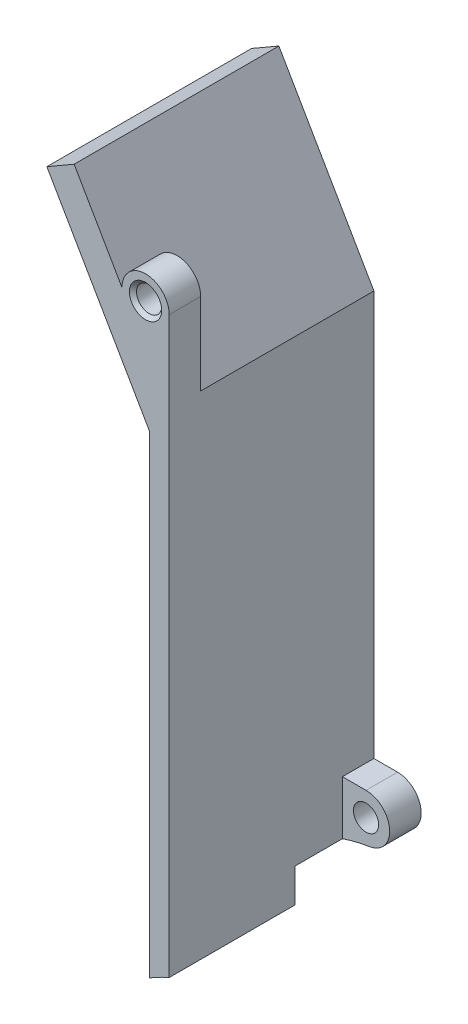
ISO-10303-21;
HEADER;
FILE_DESCRIPTION(('STEP AP214'),'2;1');
FILE_NAME('part.step','',(''),(''),'','','');
FILE_SCHEMA(('AUTOMOTIVE_DESIGN { 1 0 10303 214 1 1 1 1 }'));
ENDSEC;
DATA;
#1=APPLICATION_CONTEXT('core data for automotive mechanical design processes');
#2=APPLICATION_PROTOCOL_DEFINITION('international standard','automotive_design',2000,#1);
#3=PRODUCT_CONTEXT('',#1,'mechanical');
#4=PRODUCT('Part','Part','',(#3));
#5=PRODUCT_RELATED_PRODUCT_CATEGORY('part','',(#4));
#6=PRODUCT_DEFINITION_FORMATION('','',#4);
#7=PRODUCT_DEFINITION_CONTEXT('part definition',#1,'design');
#8=PRODUCT_DEFINITION('design','',#6,#7);
#9=PRODUCT_DEFINITION_SHAPE('','',#8);
#10=(LENGTH_UNIT() NAMED_UNIT(*) SI_UNIT(.MILLI.,.METRE.));
#11=(NAMED_UNIT(*) PLANE_ANGLE_UNIT() SI_UNIT($,.RADIAN.));
#12=(NAMED_UNIT(*) SI_UNIT($,.STERADIAN.) SOLID_ANGLE_UNIT());
#13=UNCERTAINTY_MEASURE_WITH_UNIT(LENGTH_MEASURE(1.E-05),#10,'distance_accuracy_value','');
#14=(GEOMETRIC_REPRESENTATION_CONTEXT(3) GLOBAL_UNCERTAINTY_ASSIGNED_CONTEXT((#13)) GLOBAL_UNIT_ASSIGNED_CONTEXT((#10,
#11,#12)) REPRESENTATION_CONTEXT('',''));
#15=CARTESIAN_POINT('',(0.,0.,0.));
#16=DIRECTION('',(0.,0.,1.));
#17=DIRECTION('',(1.,0.,0.));
#18=AXIS2_PLACEMENT_3D('',#15,#16,#17);
#19=CARTESIAN_POINT('',(2.57088886237952,0.,-15.));
#20=DIRECTION('',(-1.,0.,0.));
#21=DIRECTION('',(0.,0.,1.));
#22=AXIS2_PLACEMENT_3D('',#19,#20,#21);
#23=PLANE('',#22);
#24=DIRECTION('',(0.,-1.,0.));
#25=VECTOR('',#24,1.);
#26=CARTESIAN_POINT('',(2.57088886237952,0.,-13.));
#27=LINE('',#26,#25);
#28=CARTESIAN_POINT('',(2.57088886237952,-38.1610373207469,-13.));
#29=VERTEX_POINT('',#28);
#30=CARTESIAN_POINT('',(2.57088886237952,-41.5716731926929,-13.));
#31=VERTEX_POINT('',#30);
#32=EDGE_CURVE('E182',#29,#31,#27,.T.);
#33=ORIENTED_EDGE('',*,*,#32,.F.);
#34=DIRECTION('',(0.,0.,-1.));
#35=VECTOR('',#34,1.);
#36=CARTESIAN_POINT('',(2.57088886237952,-38.1610373207469,-13.));
#37=LINE('',#36,#35);
#38=CARTESIAN_POINT('',(2.57088886237952,-38.1610373207469,-15.));
#39=VERTEX_POINT('',#38);
#40=EDGE_CURVE('E193',#29,#39,#37,.T.);
#41=ORIENTED_EDGE('',*,*,#40,.T.);
#42=DIRECTION('',(0.,-1.,0.));
#43=VECTOR('',#42,1.);
#44=CARTESIAN_POINT('',(2.57088886237952,0.,-15.));
#45=LINE('',#44,#43);
#46=CARTESIAN_POINT('',(2.57088886237952,-12.4529101302543,-15.));
#47=VERTEX_POINT('',#46);
#48=EDGE_CURVE('E211',#47,#39,#45,.T.);
#49=ORIENTED_EDGE('',*,*,#48,.F.);
#50=DIRECTION('',(0.,0.,1.));
#51=VECTOR('',#50,1.);
#52=CARTESIAN_POINT('',(2.57088886237952,-12.4529101302543,-15.));
#53=LINE('',#52,#51);
#54=CARTESIAN_POINT('',(2.57088886237953,-12.4529101302543,-4.));
#55=VERTEX_POINT('',#54);
#56=EDGE_CURVE('E167',#47,#55,#53,.T.);
#57=ORIENTED_EDGE('',*,*,#56,.T.);
#58=DIRECTION('',(0.,1.,0.));
#59=VECTOR('',#58,1.);
#60=CARTESIAN_POINT('',(2.57088886237952,0.,-4.));
#61=LINE('',#60,#59);
#62=CARTESIAN_POINT('',(2.57088886237952,-7.25675770754768,-4.));
#63=VERTEX_POINT('',#62);
#64=EDGE_CURVE('E162',#55,#63,#61,.T.);
#65=ORIENTED_EDGE('',*,*,#64,.T.);
#66=DIRECTION('',(0.,0.,1.));
#67=VECTOR('',#66,1.);
#68=CARTESIAN_POINT('',(2.57088886237952,-7.25675770754768,-4.));
#69=LINE('',#68,#67);
#70=CARTESIAN_POINT('',(2.57088886237952,-7.25675770754768,-2.));
#71=VERTEX_POINT('',#70);
#72=EDGE_CURVE('E147',#63,#71,#69,.T.);
#73=ORIENTED_EDGE('',*,*,#72,.T.);
#74=DIRECTION('',(0.,-1.,0.));
#75=VECTOR('',#74,1.);
#76=CARTESIAN_POINT('',(2.57088886237952,0.,-2.));
#77=LINE('',#76,#75);
#78=CARTESIAN_POINT('',(2.57088886237952,-43.7084380241115,-2.));
#79=VERTEX_POINT('',#78);
#80=EDGE_CURVE('E230',#71,#79,#77,.T.);
#81=ORIENTED_EDGE('',*,*,#80,.T.);
#82=DIRECTION('',(0.,0.,1.));
#83=VECTOR('',#82,1.);
#84=CARTESIAN_POINT('',(2.57088886237952,-43.7084380241115,-15.));
#85=LINE('',#84,#83);
#86=CARTESIAN_POINT('',(2.57088886237952,-43.7084380241115,-10.));
#87=VERTEX_POINT('',#86);
#88=EDGE_CURVE('E227',#87,#79,#85,.T.);
#89=ORIENTED_EDGE('',*,*,#88,.F.);
#90=DIRECTION('',(0.,-1.,0.));
#91=VECTOR('',#90,1.);
#92=CARTESIAN_POINT('',(2.57088886237952,0.,-10.));
#93=LINE('',#92,#91);
#94=CARTESIAN_POINT('',(2.57088886237952,-41.5716731926929,-10.));
#95=VERTEX_POINT('',#94);
#96=EDGE_CURVE('E57',#95,#87,#93,.T.);
#97=ORIENTED_EDGE('',*,*,#96,.F.);
#98=DIRECTION('',(0.,0.,-1.));
#99=VECTOR('',#98,1.);
#100=CARTESIAN_POINT('',(2.57088886237952,-41.5716731926929,-10.));
#101=LINE('',#100,#99);
#102=EDGE_CURVE('E200',#95,#31,#101,.T.);
#103=ORIENTED_EDGE('',*,*,#102,.T.);
#104=EDGE_LOOP('',(#33,#41,#49,#57,#65,#73,#81,#89,#97,#103));
#105=FACE_BOUND('',#104,.T.);
#106=ADVANCED_FACE('F48',(#105),#23,.F.);
#107=CARTESIAN_POINT('',(6.07088886237952,-52.,-15.));
#108=DIRECTION('',(0.,0.,1.));
#109=DIRECTION('',(1.,0.,0.));
#110=AXIS2_PLACEMENT_3D('',#107,#108,#109);
#111=CYLINDRICAL_SURFACE('',#110,9.);
#112=CARTESIAN_POINT('',(6.07088886237952,-52.,-10.));
#113=DIRECTION('',(0.,0.,-1.));
#114=DIRECTION('',(-1.,0.,0.));
#115=AXIS2_PLACEMENT_3D('',#112,#113,#114);
#116=CIRCLE('',#115,9.);
#117=CARTESIAN_POINT('',(1.32088886237954,-44.3555575742897,-10.));
#118=VERTEX_POINT('',#117);
#119=EDGE_CURVE('E205',#87,#118,#116,.F.);
#120=ORIENTED_EDGE('',*,*,#119,.F.);
#121=ORIENTED_EDGE('',*,*,#88,.T.);
#122=CARTESIAN_POINT('',(6.07088886237952,-52.,-2.));
#123=DIRECTION('',(0.,0.,1.));
#124=DIRECTION('',(1.,0.,0.));
#125=AXIS2_PLACEMENT_3D('',#122,#123,#124);
#126=CIRCLE('',#125,9.);
#127=CARTESIAN_POINT('',(1.32088886237953,-44.3555575742896,-2.));
#128=VERTEX_POINT('',#127);
#129=EDGE_CURVE('E210',#79,#128,#126,.T.);
#130=ORIENTED_EDGE('',*,*,#129,.T.);
#131=DIRECTION('',(0.,0.,1.));
#132=VECTOR('',#131,1.);
#133=CARTESIAN_POINT('',(1.32088886237953,-44.3555575742896,-15.));
#134=LINE('',#133,#132);
#135=EDGE_CURVE('E242',#118,#128,#134,.T.);
#136=ORIENTED_EDGE('',*,*,#135,.F.);
#137=EDGE_LOOP('',(#120,#121,#130,#136));
#138=FACE_BOUND('',#137,.T.);
#139=ADVANCED_FACE('F50',(#138),#111,.F.);
#140=CARTESIAN_POINT('',(1.32088886237952,0.,-15.));
#141=DIRECTION('',(-1.,0.,0.));
#142=DIRECTION('',(0.,-1.,0.));
#143=AXIS2_PLACEMENT_3D('',#140,#141,#142);
#144=PLANE('',#143);
#145=DIRECTION('',(0.,0.,-1.));
#146=VECTOR('',#145,1.);
#147=CARTESIAN_POINT('',(1.32088886237953,-42.0784325835078,-10.));
#148=LINE('',#147,#146);
#149=CARTESIAN_POINT('',(1.32088886237953,-42.0784325835078,-10.));
#150=VERTEX_POINT('',#149);
#151=CARTESIAN_POINT('',(1.32088886237953,-42.0784325835078,-15.));
#152=VERTEX_POINT('',#151);
#153=EDGE_CURVE('E73',#150,#152,#148,.T.);
#154=ORIENTED_EDGE('',*,*,#153,.F.);
#155=DIRECTION('',(0.,-1.,0.));
#156=VECTOR('',#155,1.);
#157=CARTESIAN_POINT('',(1.32088886237952,0.,-10.));
#158=LINE('',#157,#156);
#159=EDGE_CURVE('E207',#150,#118,#158,.T.);
#160=ORIENTED_EDGE('',*,*,#159,.T.);
#161=ORIENTED_EDGE('',*,*,#135,.T.);
#162=DIRECTION('',(0.,-1.,0.));
#163=VECTOR('',#162,1.);
#164=CARTESIAN_POINT('',(1.32088886237952,0.,-2.));
#165=LINE('',#164,#163);
#166=CARTESIAN_POINT('',(1.32088886237953,-14.2878466207932,-2.));
#167=VERTEX_POINT('',#166);
#168=EDGE_CURVE('E215',#167,#128,#165,.T.);
#169=ORIENTED_EDGE('',*,*,#168,.F.);
#170=DIRECTION('',(0.,0.,1.));
#171=VECTOR('',#170,1.);
#172=CARTESIAN_POINT('',(1.32088886237953,-14.2878466207932,-15.));
#173=LINE('',#172,#171);
#174=CARTESIAN_POINT('',(1.32088886237953,-14.2878466207932,-15.));
#175=VERTEX_POINT('',#174);
#176=EDGE_CURVE('E244',#175,#167,#173,.T.);
#177=ORIENTED_EDGE('',*,*,#176,.F.);
#178=DIRECTION('',(0.,-1.,0.));
#179=VECTOR('',#178,1.);
#180=CARTESIAN_POINT('',(1.32088886237952,0.,-15.));
#181=LINE('',#180,#179);
#182=EDGE_CURVE('E224',#175,#152,#181,.T.);
#183=ORIENTED_EDGE('',*,*,#182,.T.);
#184=EDGE_LOOP('',(#154,#160,#161,#169,#177,#183));
#185=FACE_BOUND('',#184,.T.);
#186=ADVANCED_FACE('F295',(#185),#144,.T.);
#187=CARTESIAN_POINT('',(-5.19615242270664,-2.99999999999999,-15.));
#188=DIRECTION('',(-0.86602540378444,-0.499999999999998,0.));
#189=DIRECTION('',(0.499999999999998,-0.86602540378444,0.));
#190=AXIS2_PLACEMENT_3D('',#187,#188,#189);
#191=PLANE('',#190);
#192=DIRECTION('',(0.499999999999998,-0.86602540378444,0.));
#193=VECTOR('',#192,1.);
#194=CARTESIAN_POINT('',(-5.19615242270664,-2.99999999999999,-2.));
#195=LINE('',#194,#193);
#196=CARTESIAN_POINT('',(-5.19615242270665,-2.99999999999997,-2.));
#197=VERTEX_POINT('',#196);
#198=EDGE_CURVE('E237',#197,#167,#195,.T.);
#199=ORIENTED_EDGE('',*,*,#198,.F.);
#200=DIRECTION('',(0.,0.,1.));
#201=VECTOR('',#200,1.);
#202=CARTESIAN_POINT('',(-5.19615242270665,-2.99999999999997,-15.));
#203=LINE('',#202,#201);
#204=CARTESIAN_POINT('',(-5.19615242270665,-2.99999999999997,-15.));
#205=VERTEX_POINT('',#204);
#206=EDGE_CURVE('E246',#205,#197,#203,.T.);
#207=ORIENTED_EDGE('',*,*,#206,.F.);
#208=DIRECTION('',(0.499999999999998,-0.86602540378444,0.));
#209=VECTOR('',#208,1.);
#210=CARTESIAN_POINT('',(-5.19615242270664,-2.99999999999999,-15.));
#211=LINE('',#210,#209);
#212=EDGE_CURVE('E221',#205,#175,#211,.T.);
#213=ORIENTED_EDGE('',*,*,#212,.T.);
#214=ORIENTED_EDGE('',*,*,#176,.T.);
#215=EDGE_LOOP('',(#199,#207,#213,#214));
#216=FACE_BOUND('',#215,.T.);
#217=ADVANCED_FACE('F299',(#216),#191,.T.);
#218=CARTESIAN_POINT('',(0.,0.,-15.));
#219=DIRECTION('',(-0.499999999999999,0.866025403784439,0.));
#220=DIRECTION('',(-0.86602540378444,-0.499999999999999,0.));
#221=AXIS2_PLACEMENT_3D('',#218,#219,#220);
#222=PLANE('',#221);
#223=DIRECTION('',(-0.86602540378444,-0.499999999999999,0.));
#224=VECTOR('',#223,1.);
#225=CARTESIAN_POINT('',(0.,0.,-2.));
#226=LINE('',#225,#224);
#227=CARTESIAN_POINT('',(-3.46410161513777,-1.99999999999997,-2.));
#228=VERTEX_POINT('',#227);
#229=EDGE_CURVE('E234',#228,#197,#226,.T.);
#230=ORIENTED_EDGE('',*,*,#229,.F.);
#231=DIRECTION('',(0.,0.,1.));
#232=VECTOR('',#231,1.);
#233=CARTESIAN_POINT('',(-3.46410161513777,-1.99999999999997,-15.));
#234=LINE('',#233,#232);
#235=CARTESIAN_POINT('',(-3.46410161513777,-1.99999999999997,-15.));
#236=VERTEX_POINT('',#235);
#237=EDGE_CURVE('E248',#236,#228,#234,.T.);
#238=ORIENTED_EDGE('',*,*,#237,.F.);
#239=DIRECTION('',(-0.86602540378444,-0.499999999999999,0.));
#240=VECTOR('',#239,1.);
#241=CARTESIAN_POINT('',(0.,0.,-15.));
#242=LINE('',#241,#240);
#243=EDGE_CURVE('E218',#236,#205,#242,.T.);
#244=ORIENTED_EDGE('',*,*,#243,.T.);
#245=ORIENTED_EDGE('',*,*,#206,.T.);
#246=EDGE_LOOP('',(#230,#238,#244,#245));
#247=FACE_BOUND('',#246,.T.);
#248=ADVANCED_FACE('F302',(#247),#222,.T.);
#249=CARTESIAN_POINT('',(-3.46410161513776,-1.99999999999999,-15.));
#250=DIRECTION('',(0.86602540378444,0.499999999999998,0.));
#251=DIRECTION('',(-0.499999999999998,0.86602540378444,0.));
#252=AXIS2_PLACEMENT_3D('',#249,#250,#251);
#253=PLANE('',#252);
#254=DIRECTION('',(0.,0.,1.));
#255=VECTOR('',#254,1.);
#256=CARTESIAN_POINT('',(-0.429111137620476,-7.25675770754767,-4.));
#257=LINE('',#256,#255);
#258=CARTESIAN_POINT('',(-0.429111137620476,-7.25675770754767,-4.));
#259=VERTEX_POINT('',#258);
#260=CARTESIAN_POINT('',(-0.429111137620476,-7.25675770754767,-2.));
#261=VERTEX_POINT('',#260);
#262=EDGE_CURVE('E157',#259,#261,#257,.T.);
#263=ORIENTED_EDGE('',*,*,#262,.F.);
#264=DIRECTION('',(0.499999999999998,-0.86602540378444,0.));
#265=VECTOR('',#264,1.);
#266=CARTESIAN_POINT('',(-3.46410161513776,-1.99999999999999,-4.));
#267=LINE('',#266,#265);
#268=EDGE_CURVE('E12',#259,#55,#267,.T.);
#269=ORIENTED_EDGE('',*,*,#268,.T.);
#270=ORIENTED_EDGE('',*,*,#56,.F.);
#271=DIRECTION('',(-0.499999999999998,0.86602540378444,0.));
#272=VECTOR('',#271,1.);
#273=CARTESIAN_POINT('',(-3.46410161513776,-1.99999999999999,-15.));
#274=LINE('',#273,#272);
#275=EDGE_CURVE('E214',#47,#236,#274,.T.);
#276=ORIENTED_EDGE('',*,*,#275,.T.);
#277=ORIENTED_EDGE('',*,*,#237,.T.);
#278=DIRECTION('',(-0.499999999999998,0.86602540378444,0.));
#279=VECTOR('',#278,1.);
#280=CARTESIAN_POINT('',(-3.46410161513776,-1.99999999999999,-2.));
#281=LINE('',#280,#279);
#282=EDGE_CURVE('E232',#261,#228,#281,.T.);
#283=ORIENTED_EDGE('',*,*,#282,.F.);
#284=EDGE_LOOP('',(#263,#269,#270,#276,#277,#283));
#285=FACE_BOUND('',#284,.T.);
#286=ADVANCED_FACE('F278',(#285),#253,.T.);
#287=CARTESIAN_POINT('',(0.,0.,-15.));
#288=DIRECTION('',(0.,0.,1.));
#289=DIRECTION('',(1.,0.,0.));
#290=AXIS2_PLACEMENT_3D('',#287,#288,#289);
#291=PLANE('',#290);
#292=CARTESIAN_POINT('',(4.07088886237953,-39.6610373207469,-15.));
#293=DIRECTION('',(0.,0.,-1.));
#294=DIRECTION('',(-1.,0.,0.));
#295=AXIS2_PLACEMENT_3D('',#292,#293,#294);
#296=CIRCLE('',#295,1.025);
#297=CARTESIAN_POINT('',(3.04588886237953,-39.6610373207469,-15.));
#298=VERTEX_POINT('',#297);
#299=EDGE_CURVE('E268',#298,#298,#296,.T.);
#300=ORIENTED_EDGE('',*,*,#299,.F.);
#301=EDGE_LOOP('',(#300));
#302=FACE_BOUND('',#301,.T.);
#303=ORIENTED_EDGE('',*,*,#48,.T.);
#304=DIRECTION('',(-1.,0.,0.));
#305=VECTOR('',#304,1.);
#306=CARTESIAN_POINT('',(0.,-38.1610373207469,-15.));
#307=LINE('',#306,#305);
#308=CARTESIAN_POINT('',(4.07088886237953,-38.1610373207469,-15.));
#309=VERTEX_POINT('',#308);
#310=EDGE_CURVE('E65',#309,#39,#307,.T.);
#311=ORIENTED_EDGE('',*,*,#310,.F.);
#312=CARTESIAN_POINT('',(4.07088886237953,-39.6610373207469,-15.));
#313=DIRECTION('',(0.,0.,-1.));
#314=DIRECTION('',(-1.,0.,0.));
#315=AXIS2_PLACEMENT_3D('',#312,#313,#314);
#316=CIRCLE('',#315,1.5);
#317=CARTESIAN_POINT('',(4.31088886237952,-41.1417128422573,-15.));
#318=VERTEX_POINT('',#317);
#319=EDGE_CURVE('E176',#309,#318,#316,.T.);
#320=ORIENTED_EDGE('',*,*,#319,.T.);
#321=CARTESIAN_POINT('',(6.07088886237952,-52.,-15.));
#322=DIRECTION('',(0.,0.,-1.));
#323=DIRECTION('',(-1.,0.,0.));
#324=AXIS2_PLACEMENT_3D('',#321,#322,#323);
#325=CIRCLE('',#324,11.);
#326=EDGE_CURVE('E192',#152,#318,#325,.T.);
#327=ORIENTED_EDGE('',*,*,#326,.F.);
#328=ORIENTED_EDGE('',*,*,#182,.F.);
#329=ORIENTED_EDGE('',*,*,#212,.F.);
#330=ORIENTED_EDGE('',*,*,#243,.F.);
#331=ORIENTED_EDGE('',*,*,#275,.F.);
#332=EDGE_LOOP('',(#303,#311,#320,#327,#328,#329,#330,#331));
#333=FACE_BOUND('',#332,.T.);
#334=ADVANCED_FACE('F274',(#302,#333),#291,.F.);
#335=CARTESIAN_POINT('',(0.,0.,-2.));
#336=DIRECTION('',(0.,0.,1.));
#337=DIRECTION('',(1.,0.,0.));
#338=AXIS2_PLACEMENT_3D('',#335,#336,#337);
#339=PLANE('',#338);
#340=CARTESIAN_POINT('',(1.07088886237952,-7.25675770754768,-2.));
#341=DIRECTION('',(0.,0.,1.));
#342=DIRECTION('',(1.,0.,0.));
#343=AXIS2_PLACEMENT_3D('',#340,#341,#342);
#344=CIRCLE('',#343,1.025);
#345=CARTESIAN_POINT('',(2.09588886237952,-7.25675770754768,-2.));
#346=VERTEX_POINT('',#345);
#347=EDGE_CURVE('E257',#346,#346,#344,.T.);
#348=ORIENTED_EDGE('',*,*,#347,.F.);
#349=EDGE_LOOP('',(#348));
#350=FACE_BOUND('',#349,.T.);
#351=CARTESIAN_POINT('',(1.07088886237952,-7.25675770754768,-2.));
#352=DIRECTION('',(0.,0.,1.));
#353=DIRECTION('',(1.,0.,0.));
#354=AXIS2_PLACEMENT_3D('',#351,#352,#353);
#355=CIRCLE('',#354,1.5);
#356=EDGE_CURVE('E153',#71,#261,#355,.T.);
#357=ORIENTED_EDGE('',*,*,#356,.T.);
#358=ORIENTED_EDGE('',*,*,#282,.T.);
#359=ORIENTED_EDGE('',*,*,#229,.T.);
#360=ORIENTED_EDGE('',*,*,#198,.T.);
#361=ORIENTED_EDGE('',*,*,#168,.T.);
#362=ORIENTED_EDGE('',*,*,#129,.F.);
#363=ORIENTED_EDGE('',*,*,#80,.F.);
#364=EDGE_LOOP('',(#357,#358,#359,#360,#361,#362,#363));
#365=FACE_BOUND('',#364,.T.);
#366=ADVANCED_FACE('F277',(#350,#365),#339,.T.);
#367=CARTESIAN_POINT('',(6.07088886237952,-52.,-10.));
#368=DIRECTION('',(0.,0.,-1.));
#369=DIRECTION('',(-1.,0.,0.));
#370=AXIS2_PLACEMENT_3D('',#367,#368,#369);
#371=CYLINDRICAL_SURFACE('',#370,11.);
#372=ORIENTED_EDGE('',*,*,#153,.T.);
#373=ORIENTED_EDGE('',*,*,#326,.T.);
#374=DIRECTION('',(0.,0.,-1.));
#375=VECTOR('',#374,1.);
#376=CARTESIAN_POINT('',(4.31088886237952,-41.1417128422573,-13.));
#377=LINE('',#376,#375);
#378=CARTESIAN_POINT('',(4.31088886237952,-41.1417128422573,-13.));
#379=VERTEX_POINT('',#378);
#380=EDGE_CURVE('E186',#379,#318,#377,.T.);
#381=ORIENTED_EDGE('',*,*,#380,.F.);
#382=CARTESIAN_POINT('',(6.07088886237952,-52.,-13.));
#383=DIRECTION('',(0.,0.,-1.));
#384=DIRECTION('',(-1.,0.,0.));
#385=AXIS2_PLACEMENT_3D('',#382,#383,#384);
#386=CIRCLE('',#385,11.);
#387=EDGE_CURVE('E180',#31,#379,#386,.T.);
#388=ORIENTED_EDGE('',*,*,#387,.F.);
#389=ORIENTED_EDGE('',*,*,#102,.F.);
#390=CARTESIAN_POINT('',(6.07088886237952,-52.,-10.));
#391=DIRECTION('',(0.,0.,-1.));
#392=DIRECTION('',(-1.,0.,0.));
#393=AXIS2_PLACEMENT_3D('',#390,#391,#392);
#394=CIRCLE('',#393,11.);
#395=EDGE_CURVE('E197',#150,#95,#394,.T.);
#396=ORIENTED_EDGE('',*,*,#395,.F.);
#397=EDGE_LOOP('',(#372,#373,#381,#388,#389,#396));
#398=FACE_BOUND('',#397,.T.);
#399=ADVANCED_FACE('F314',(#398),#371,.F.);
#400=CARTESIAN_POINT('',(6.07088886237952,-52.,-10.));
#401=DIRECTION('',(0.,0.,-1.));
#402=DIRECTION('',(-1.,0.,0.));
#403=AXIS2_PLACEMENT_3D('',#400,#401,#402);
#404=PLANE('',#403);
#405=ORIENTED_EDGE('',*,*,#395,.T.);
#406=ORIENTED_EDGE('',*,*,#96,.T.);
#407=ORIENTED_EDGE('',*,*,#119,.T.);
#408=ORIENTED_EDGE('',*,*,#159,.F.);
#409=EDGE_LOOP('',(#405,#406,#407,#408));
#410=FACE_BOUND('',#409,.T.);
#411=ADVANCED_FACE('F313',(#410),#404,.T.);
#412=CARTESIAN_POINT('',(4.07088886237953,-39.6610373207469,-13.));
#413=DIRECTION('',(0.,0.,-1.));
#414=DIRECTION('',(-1.,0.,0.));
#415=AXIS2_PLACEMENT_3D('',#412,#413,#414);
#416=CYLINDRICAL_SURFACE('',#415,1.5);
#417=ORIENTED_EDGE('',*,*,#319,.F.);
#418=DIRECTION('',(0.,0.,-1.));
#419=VECTOR('',#418,1.);
#420=CARTESIAN_POINT('',(4.07088886237953,-38.1610373207469,-13.));
#421=LINE('',#420,#419);
#422=CARTESIAN_POINT('',(4.07088886237953,-38.1610373207469,-13.));
#423=VERTEX_POINT('',#422);
#424=EDGE_CURVE('E190',#423,#309,#421,.T.);
#425=ORIENTED_EDGE('',*,*,#424,.F.);
#426=CARTESIAN_POINT('',(4.07088886237953,-39.6610373207469,-13.));
#427=DIRECTION('',(0.,0.,-1.));
#428=DIRECTION('',(-1.,0.,0.));
#429=AXIS2_PLACEMENT_3D('',#426,#427,#428);
#430=CIRCLE('',#429,1.5);
#431=EDGE_CURVE('E177',#423,#379,#430,.T.);
#432=ORIENTED_EDGE('',*,*,#431,.T.);
#433=ORIENTED_EDGE('',*,*,#380,.T.);
#434=EDGE_LOOP('',(#417,#425,#432,#433));
#435=FACE_BOUND('',#434,.T.);
#436=ADVANCED_FACE('F291',(#435),#416,.T.);
#437=CARTESIAN_POINT('',(0.,-38.1610373207469,-13.));
#438=DIRECTION('',(0.,-1.,0.));
#439=DIRECTION('',(0.,0.,-1.));
#440=AXIS2_PLACEMENT_3D('',#437,#438,#439);
#441=PLANE('',#440);
#442=ORIENTED_EDGE('',*,*,#310,.T.);
#443=ORIENTED_EDGE('',*,*,#40,.F.);
#444=DIRECTION('',(-1.,0.,0.));
#445=VECTOR('',#444,1.);
#446=CARTESIAN_POINT('',(0.,-38.1610373207469,-13.));
#447=LINE('',#446,#445);
#448=EDGE_CURVE('E184',#423,#29,#447,.T.);
#449=ORIENTED_EDGE('',*,*,#448,.F.);
#450=ORIENTED_EDGE('',*,*,#424,.T.);
#451=EDGE_LOOP('',(#442,#443,#449,#450));
#452=FACE_BOUND('',#451,.T.);
#453=ADVANCED_FACE('F284',(#452),#441,.F.);
#454=CARTESIAN_POINT('',(0.,0.,-13.));
#455=DIRECTION('',(0.,0.,-1.));
#456=DIRECTION('',(-1.,0.,0.));
#457=AXIS2_PLACEMENT_3D('',#454,#455,#456);
#458=PLANE('',#457);
#459=CARTESIAN_POINT('',(4.07088886237953,-39.6610373207469,-13.));
#460=DIRECTION('',(0.,0.,-1.));
#461=DIRECTION('',(-1.,0.,0.));
#462=AXIS2_PLACEMENT_3D('',#459,#460,#461);
#463=CIRCLE('',#462,0.799999999999989);
#464=CARTESIAN_POINT('',(3.27088886237954,-39.6610373207469,-13.));
#465=VERTEX_POINT('',#464);
#466=EDGE_CURVE('E52',#465,#465,#463,.T.);
#467=ORIENTED_EDGE('',*,*,#466,.T.);
#468=EDGE_LOOP('',(#467));
#469=FACE_BOUND('',#468,.T.);
#470=ORIENTED_EDGE('',*,*,#431,.F.);
#471=ORIENTED_EDGE('',*,*,#448,.T.);
#472=ORIENTED_EDGE('',*,*,#32,.T.);
#473=ORIENTED_EDGE('',*,*,#387,.T.);
#474=EDGE_LOOP('',(#470,#471,#472,#473));
#475=FACE_BOUND('',#474,.T.);
#476=ADVANCED_FACE('F287',(#469,#475),#458,.F.);
#477=CARTESIAN_POINT('',(1.07088886237952,-7.25675770754768,-4.));
#478=DIRECTION('',(0.,0.,1.));
#479=DIRECTION('',(1.,0.,0.));
#480=AXIS2_PLACEMENT_3D('',#477,#478,#479);
#481=CYLINDRICAL_SURFACE('',#480,1.5);
#482=CARTESIAN_POINT('',(1.07088886237952,-7.25675770754768,-4.));
#483=DIRECTION('',(0.,0.,1.));
#484=DIRECTION('',(1.,0.,0.));
#485=AXIS2_PLACEMENT_3D('',#482,#483,#484);
#486=CIRCLE('',#485,1.5);
#487=EDGE_CURVE('E150',#63,#259,#486,.T.);
#488=ORIENTED_EDGE('',*,*,#487,.T.);
#489=ORIENTED_EDGE('',*,*,#262,.T.);
#490=ORIENTED_EDGE('',*,*,#356,.F.);
#491=ORIENTED_EDGE('',*,*,#72,.F.);
#492=EDGE_LOOP('',(#488,#489,#490,#491));
#493=FACE_BOUND('',#492,.T.);
#494=ADVANCED_FACE('F149',(#493),#481,.T.);
#495=CARTESIAN_POINT('',(0.,0.,-4.));
#496=DIRECTION('',(0.,0.,1.));
#497=DIRECTION('',(1.,0.,0.));
#498=AXIS2_PLACEMENT_3D('',#495,#496,#497);
#499=PLANE('',#498);
#500=CARTESIAN_POINT('',(1.07088886237952,-7.25675770754768,-4.));
#501=DIRECTION('',(0.,0.,1.));
#502=DIRECTION('',(1.,0.,0.));
#503=AXIS2_PLACEMENT_3D('',#500,#501,#502);
#504=CIRCLE('',#503,0.799999999999989);
#505=CARTESIAN_POINT('',(1.87088886237951,-7.25675770754768,-4.));
#506=VERTEX_POINT('',#505);
#507=EDGE_CURVE('E169',#506,#506,#504,.T.);
#508=ORIENTED_EDGE('',*,*,#507,.T.);
#509=EDGE_LOOP('',(#508));
#510=FACE_BOUND('',#509,.T.);
#511=ORIENTED_EDGE('',*,*,#268,.F.);
#512=ORIENTED_EDGE('',*,*,#487,.F.);
#513=ORIENTED_EDGE('',*,*,#64,.F.);
#514=EDGE_LOOP('',(#511,#512,#513));
#515=FACE_BOUND('',#514,.T.);
#516=ADVANCED_FACE('F161',(#510,#515),#499,.F.);
#517=CARTESIAN_POINT('',(1.07088886237952,-7.25675770754768,-2.));
#518=DIRECTION('',(0.,0.,1.));
#519=DIRECTION('',(1.,0.,0.));
#520=AXIS2_PLACEMENT_3D('',#517,#518,#519);
#521=CYLINDRICAL_SURFACE('',#520,0.799999999999989);
#522=CARTESIAN_POINT('',(1.07088886237952,-7.25675770754768,-2.225));
#523=DIRECTION('',(0.,0.,1.));
#524=DIRECTION('',(1.,0.,0.));
#525=AXIS2_PLACEMENT_3D('',#522,#523,#524);
#526=CIRCLE('',#525,0.79999999999999);
#527=CARTESIAN_POINT('',(1.87088886237951,-7.25675770754768,-2.225));
#528=VERTEX_POINT('',#527);
#529=EDGE_CURVE('E172',#528,#528,#526,.T.);
#530=ORIENTED_EDGE('',*,*,#529,.T.);
#531=EDGE_LOOP('',(#530));
#532=FACE_BOUND('',#531,.T.);
#533=ORIENTED_EDGE('',*,*,#507,.F.);
#534=EDGE_LOOP('',(#533));
#535=FACE_BOUND('',#534,.T.);
#536=ADVANCED_FACE('F378',(#532,#535),#521,.F.);
#537=CARTESIAN_POINT('',(1.07088886237952,-7.25675770754768,-2.));
#538=DIRECTION('',(0.,0.,1.));
#539=DIRECTION('',(1.,0.,0.));
#540=AXIS2_PLACEMENT_3D('',#537,#538,#539);
#541=CONICAL_SURFACE('',#540,1.025,0.78539816339746);
#542=ORIENTED_EDGE('',*,*,#529,.F.);
#543=EDGE_LOOP('',(#542));
#544=FACE_BOUND('',#543,.T.);
#545=ORIENTED_EDGE('',*,*,#347,.T.);
#546=EDGE_LOOP('',(#545));
#547=FACE_BOUND('',#546,.T.);
#548=ADVANCED_FACE('F388',(#544,#547),#541,.F.);
#549=CARTESIAN_POINT('',(4.07088886237953,-39.6610373207469,-15.));
#550=DIRECTION('',(0.,0.,-1.));
#551=DIRECTION('',(-1.,0.,0.));
#552=AXIS2_PLACEMENT_3D('',#549,#550,#551);
#553=CYLINDRICAL_SURFACE('',#552,0.799999999999989);
#554=CARTESIAN_POINT('',(4.07088886237953,-39.6610373207469,-14.775));
#555=DIRECTION('',(0.,0.,-1.));
#556=DIRECTION('',(-1.,0.,0.));
#557=AXIS2_PLACEMENT_3D('',#554,#555,#556);
#558=CIRCLE('',#557,0.79999999999999);
#559=CARTESIAN_POINT('',(3.27088886237954,-39.6610373207469,-14.775));
#560=VERTEX_POINT('',#559);
#561=EDGE_CURVE('E264',#560,#560,#558,.T.);
#562=ORIENTED_EDGE('',*,*,#561,.T.);
#563=EDGE_LOOP('',(#562));
#564=FACE_BOUND('',#563,.T.);
#565=ORIENTED_EDGE('',*,*,#466,.F.);
#566=EDGE_LOOP('',(#565));
#567=FACE_BOUND('',#566,.T.);
#568=ADVANCED_FACE('F397',(#564,#567),#553,.F.);
#569=CARTESIAN_POINT('',(4.07088886237953,-39.6610373207469,-15.));
#570=DIRECTION('',(0.,0.,-1.));
#571=DIRECTION('',(-1.,0.,0.));
#572=AXIS2_PLACEMENT_3D('',#569,#570,#571);
#573=CONICAL_SURFACE('',#572,1.025,0.78539816339746);
#574=ORIENTED_EDGE('',*,*,#561,.F.);
#575=EDGE_LOOP('',(#574));
#576=FACE_BOUND('',#575,.T.);
#577=ORIENTED_EDGE('',*,*,#299,.T.);
#578=EDGE_LOOP('',(#577));
#579=FACE_BOUND('',#578,.T.);
#580=ADVANCED_FACE('F272',(#576,#579),#573,.F.);
#581=CLOSED_SHELL('',(#106,#139,#186,#217,#248,#286,#334,#366,#399,#411,#436,#453,#476,#494,
#516,#536,#548,#568,#580));
#582=MANIFOLD_SOLID_BREP('B2',#581);
#583=ADVANCED_BREP_SHAPE_REPRESENTATION('',(#18,#582),#14);
#584=SHAPE_DEFINITION_REPRESENTATION(#9,#583);
ENDSEC;
END-ISO-10303-21;
